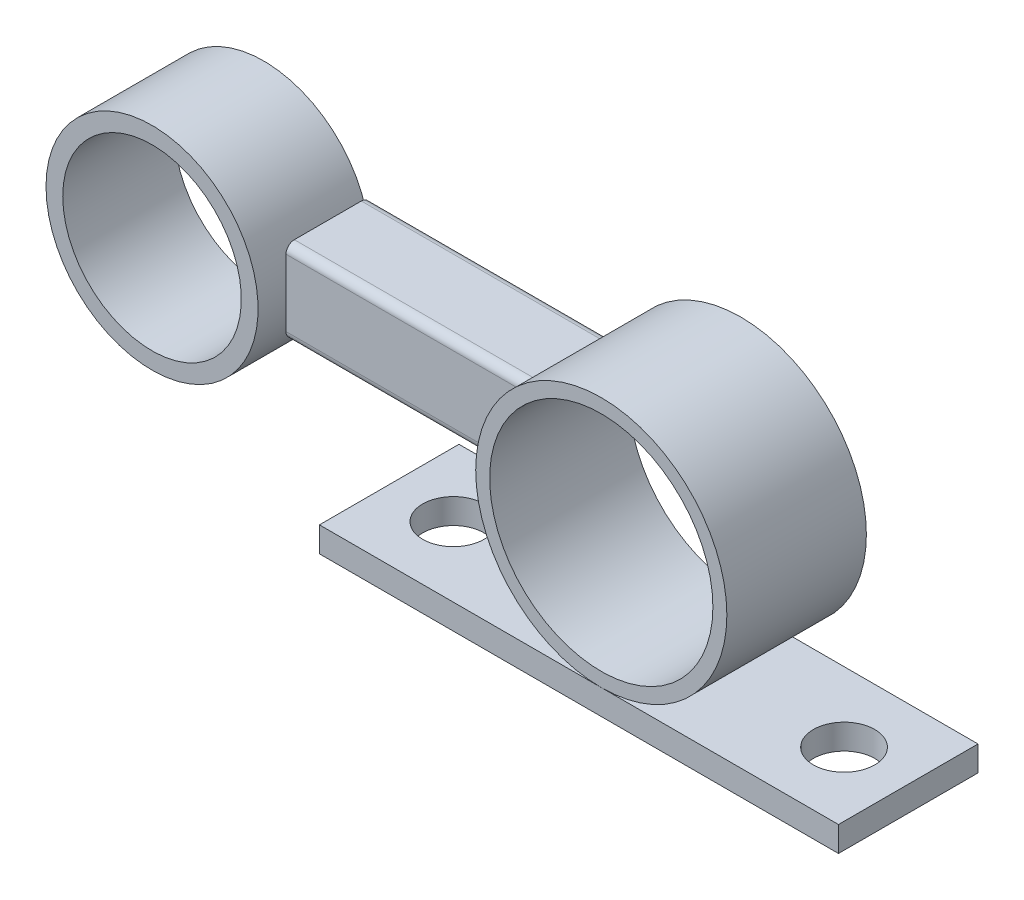
ISO-10303-21;
HEADER;
FILE_DESCRIPTION(('STEP AP214'),'2;1');
FILE_NAME('part.step','',(''),(''),'','','');
FILE_SCHEMA(('AUTOMOTIVE_DESIGN { 1 0 10303 214 1 1 1 1 }'));
ENDSEC;
DATA;
#1=APPLICATION_CONTEXT('core data for automotive mechanical design processes');
#2=APPLICATION_PROTOCOL_DEFINITION('international standard','automotive_design',2000,#1);
#3=PRODUCT_CONTEXT('',#1,'mechanical');
#4=PRODUCT('Part','Part','',(#3));
#5=PRODUCT_RELATED_PRODUCT_CATEGORY('part','',(#4));
#6=PRODUCT_DEFINITION_FORMATION('','',#4);
#7=PRODUCT_DEFINITION_CONTEXT('part definition',#1,'design');
#8=PRODUCT_DEFINITION('design','',#6,#7);
#9=PRODUCT_DEFINITION_SHAPE('','',#8);
#10=(LENGTH_UNIT() NAMED_UNIT(*) SI_UNIT(.MILLI.,.METRE.));
#11=(NAMED_UNIT(*) PLANE_ANGLE_UNIT() SI_UNIT($,.RADIAN.));
#12=(NAMED_UNIT(*) SI_UNIT($,.STERADIAN.) SOLID_ANGLE_UNIT());
#13=UNCERTAINTY_MEASURE_WITH_UNIT(LENGTH_MEASURE(1.E-05),#10,'distance_accuracy_value','');
#14=(GEOMETRIC_REPRESENTATION_CONTEXT(3) GLOBAL_UNCERTAINTY_ASSIGNED_CONTEXT((#13)) GLOBAL_UNIT_ASSIGNED_CONTEXT((#10,
#11,#12)) REPRESENTATION_CONTEXT('',''));
#15=CARTESIAN_POINT('',(0.,0.,0.));
#16=DIRECTION('',(0.,0.,1.));
#17=DIRECTION('',(1.,0.,0.));
#18=AXIS2_PLACEMENT_3D('',#15,#16,#17);
#19=CARTESIAN_POINT('',(-81.494443758404,27.4999999999999,7.49999999999995));
#20=DIRECTION('',(0.,0.,-1.));
#21=DIRECTION('',(-1.,0.,0.));
#22=AXIS2_PLACEMENT_3D('',#19,#20,#21);
#23=CYLINDRICAL_SURFACE('',#22,19.);
#24=CARTESIAN_POINT('',(-81.494443758404,27.4999999999999,7.49999999999995));
#25=DIRECTION('',(0.,0.,-1.));
#26=DIRECTION('',(-1.,0.,0.));
#27=AXIS2_PLACEMENT_3D('',#24,#25,#26);
#28=CIRCLE('',#27,19.);
#29=CARTESIAN_POINT('',(-100.494443758404,27.4999999999999,7.49999999999995));
#30=VERTEX_POINT('',#29);
#31=EDGE_CURVE('E14',#30,#30,#28,.T.);
#32=ORIENTED_EDGE('',*,*,#31,.T.);
#33=EDGE_LOOP('',(#32));
#34=FACE_BOUND('',#33,.T.);
#35=CARTESIAN_POINT('',(-81.494443758404,27.4999999999999,-12.5));
#36=DIRECTION('',(0.,0.,-1.));
#37=DIRECTION('',(-1.,0.,0.));
#38=AXIS2_PLACEMENT_3D('',#35,#36,#37);
#39=CIRCLE('',#38,19.);
#40=CARTESIAN_POINT('',(-100.494443758404,27.4999999999999,-12.5));
#41=VERTEX_POINT('',#40);
#42=EDGE_CURVE('E88',#41,#41,#39,.T.);
#43=ORIENTED_EDGE('',*,*,#42,.F.);
#44=EDGE_LOOP('',(#43));
#45=FACE_BOUND('',#44,.T.);
#46=ADVANCED_FACE('F85',(#34,#45),#23,.T.);
#47=CARTESIAN_POINT('',(-81.494443758404,27.4999999999999,7.49999999999995));
#48=DIRECTION('',(0.,0.,-1.));
#49=DIRECTION('',(-1.,0.,0.));
#50=AXIS2_PLACEMENT_3D('',#47,#48,#49);
#51=PLANE('',#50);
#52=CARTESIAN_POINT('',(-81.494443758404,27.4999999999999,7.49999999999995));
#53=DIRECTION('',(0.,0.,-1.));
#54=DIRECTION('',(-1.,0.,0.));
#55=AXIS2_PLACEMENT_3D('',#52,#53,#54);
#56=CIRCLE('',#55,16.);
#57=CARTESIAN_POINT('',(-97.494443758404,27.4999999999999,7.49999999999995));
#58=VERTEX_POINT('',#57);
#59=EDGE_CURVE('E95',#58,#58,#56,.T.);
#60=ORIENTED_EDGE('',*,*,#59,.T.);
#61=EDGE_LOOP('',(#60));
#62=FACE_BOUND('',#61,.T.);
#63=ORIENTED_EDGE('',*,*,#31,.F.);
#64=EDGE_LOOP('',(#63));
#65=FACE_BOUND('',#64,.T.);
#66=ADVANCED_FACE('F103',(#62,#65),#51,.F.);
#67=CARTESIAN_POINT('',(-81.494443758404,27.4999999999999,-12.5));
#68=DIRECTION('',(0.,0.,-1.));
#69=DIRECTION('',(-1.,0.,0.));
#70=AXIS2_PLACEMENT_3D('',#67,#68,#69);
#71=PLANE('',#70);
#72=CARTESIAN_POINT('',(-81.494443758404,27.4999999999999,-12.5));
#73=DIRECTION('',(0.,0.,-1.));
#74=DIRECTION('',(-1.,0.,0.));
#75=AXIS2_PLACEMENT_3D('',#72,#73,#74);
#76=CIRCLE('',#75,16.);
#77=CARTESIAN_POINT('',(-97.494443758404,27.4999999999999,-12.5));
#78=VERTEX_POINT('',#77);
#79=EDGE_CURVE('E97',#78,#78,#76,.T.);
#80=ORIENTED_EDGE('',*,*,#79,.F.);
#81=EDGE_LOOP('',(#80));
#82=FACE_BOUND('',#81,.T.);
#83=ORIENTED_EDGE('',*,*,#42,.T.);
#84=EDGE_LOOP('',(#83));
#85=FACE_BOUND('',#84,.T.);
#86=ADVANCED_FACE('F109',(#82,#85),#71,.T.);
#87=CARTESIAN_POINT('',(-81.494443758404,27.4999999999999,7.49999999999995));
#88=DIRECTION('',(0.,0.,-1.));
#89=DIRECTION('',(-1.,0.,0.));
#90=AXIS2_PLACEMENT_3D('',#87,#88,#89);
#91=CYLINDRICAL_SURFACE('',#90,16.);
#92=ORIENTED_EDGE('',*,*,#59,.F.);
#93=EDGE_LOOP('',(#92));
#94=FACE_BOUND('',#93,.T.);
#95=ORIENTED_EDGE('',*,*,#79,.T.);
#96=EDGE_LOOP('',(#95));
#97=FACE_BOUND('',#96,.T.);
#98=ADVANCED_FACE('F106',(#94,#97),#91,.F.);
#99=CLOSED_SHELL('',(#46,#66,#86,#98));
#100=MANIFOLD_SOLID_BREP('B2',#99);
#101=CARTESIAN_POINT('',(-18.494443758404,21.5,-11.));
#102=DIRECTION('',(-1.,0.,0.));
#103=DIRECTION('',(0.,0.,1.));
#104=AXIS2_PLACEMENT_3D('',#101,#102,#103);
#105=CYLINDRICAL_SURFACE('',#104,1.5);
#106=CARTESIAN_POINT('',(-62.4944437584039,21.4999999999999,-11.));
#107=DIRECTION('',(1.,0.,0.));
#108=DIRECTION('',(0.,0.,-1.));
#109=AXIS2_PLACEMENT_3D('',#106,#107,#108);
#110=CIRCLE('',#109,1.5);
#111=CARTESIAN_POINT('',(-62.4944437584039,19.9999999999999,-11.));
#112=VERTEX_POINT('',#111);
#113=CARTESIAN_POINT('',(-62.4944437584039,21.4999999999999,-12.5));
#114=VERTEX_POINT('',#113);
#115=EDGE_CURVE('E320',#112,#114,#110,.T.);
#116=ORIENTED_EDGE('',*,*,#115,.T.);
#117=DIRECTION('',(-1.,0.,0.));
#118=VECTOR('',#117,1.);
#119=CARTESIAN_POINT('',(-18.494443758404,21.5,-12.5));
#120=LINE('',#119,#118);
#121=CARTESIAN_POINT('',(-18.494443758404,21.5,-12.5));
#122=VERTEX_POINT('',#121);
#123=EDGE_CURVE('E83',#122,#114,#120,.T.);
#124=ORIENTED_EDGE('',*,*,#123,.F.);
#125=CARTESIAN_POINT('',(-18.494443758404,21.5,-11.));
#126=DIRECTION('',(1.,0.,0.));
#127=DIRECTION('',(0.,0.,-1.));
#128=AXIS2_PLACEMENT_3D('',#125,#126,#127);
#129=CIRCLE('',#128,1.5);
#130=CARTESIAN_POINT('',(-18.494443758404,20.,-11.));
#131=VERTEX_POINT('',#130);
#132=EDGE_CURVE('E398',#131,#122,#129,.T.);
#133=ORIENTED_EDGE('',*,*,#132,.F.);
#134=DIRECTION('',(-1.,0.,0.));
#135=VECTOR('',#134,1.);
#136=CARTESIAN_POINT('',(-18.494443758404,20.,-11.));
#137=LINE('',#136,#135);
#138=EDGE_CURVE('E335',#131,#112,#137,.T.);
#139=ORIENTED_EDGE('',*,*,#138,.T.);
#140=EDGE_LOOP('',(#116,#124,#133,#139));
#141=FACE_BOUND('',#140,.T.);
#142=ADVANCED_FACE('F148',(#141),#105,.T.);
#143=CARTESIAN_POINT('',(-18.494443758404,21.5,-12.5));
#144=DIRECTION('',(0.,0.,1.));
#145=DIRECTION('',(1.,0.,0.));
#146=AXIS2_PLACEMENT_3D('',#143,#144,#145);
#147=PLANE('',#146);
#148=DIRECTION('',(0.,1.,0.));
#149=VECTOR('',#148,1.);
#150=CARTESIAN_POINT('',(-62.4944437584039,21.4999999999999,-12.5));
#151=LINE('',#150,#149);
#152=CARTESIAN_POINT('',(-62.4944437584039,33.4999999999999,-12.5));
#153=VERTEX_POINT('',#152);
#154=EDGE_CURVE('E323',#114,#153,#151,.T.);
#155=ORIENTED_EDGE('',*,*,#154,.T.);
#156=DIRECTION('',(-1.,0.,0.));
#157=VECTOR('',#156,1.);
#158=CARTESIAN_POINT('',(-18.494443758404,33.5,-12.5));
#159=LINE('',#158,#157);
#160=CARTESIAN_POINT('',(-18.494443758404,33.5,-12.5));
#161=VERTEX_POINT('',#160);
#162=EDGE_CURVE('E158',#161,#153,#159,.T.);
#163=ORIENTED_EDGE('',*,*,#162,.F.);
#164=DIRECTION('',(0.,1.,0.));
#165=VECTOR('',#164,1.);
#166=CARTESIAN_POINT('',(-18.494443758404,21.5,-12.5));
#167=LINE('',#166,#165);
#168=EDGE_CURVE('E400',#122,#161,#167,.T.);
#169=ORIENTED_EDGE('',*,*,#168,.F.);
#170=ORIENTED_EDGE('',*,*,#123,.T.);
#171=EDGE_LOOP('',(#155,#163,#169,#170));
#172=FACE_BOUND('',#171,.T.);
#173=ADVANCED_FACE('F435',(#172),#147,.F.);
#174=CARTESIAN_POINT('',(-18.494443758404,33.5,-11.));
#175=DIRECTION('',(-1.,0.,0.));
#176=DIRECTION('',(0.,0.,1.));
#177=AXIS2_PLACEMENT_3D('',#174,#175,#176);
#178=CYLINDRICAL_SURFACE('',#177,1.5);
#179=CARTESIAN_POINT('',(-62.4944437584039,33.4999999999999,-11.));
#180=DIRECTION('',(1.,0.,0.));
#181=DIRECTION('',(0.,0.,-1.));
#182=AXIS2_PLACEMENT_3D('',#179,#180,#181);
#183=CIRCLE('',#182,1.5);
#184=CARTESIAN_POINT('',(-62.4944437584039,34.9999999999999,-11.));
#185=VERTEX_POINT('',#184);
#186=EDGE_CURVE('E325',#153,#185,#183,.T.);
#187=ORIENTED_EDGE('',*,*,#186,.T.);
#188=DIRECTION('',(-1.,0.,0.));
#189=VECTOR('',#188,1.);
#190=CARTESIAN_POINT('',(-18.494443758404,35.,-11.));
#191=LINE('',#190,#189);
#192=CARTESIAN_POINT('',(-18.494443758404,35.,-11.));
#193=VERTEX_POINT('',#192);
#194=EDGE_CURVE('E342',#193,#185,#191,.T.);
#195=ORIENTED_EDGE('',*,*,#194,.F.);
#196=CARTESIAN_POINT('',(-18.494443758404,33.5,-11.));
#197=DIRECTION('',(1.,0.,0.));
#198=DIRECTION('',(0.,0.,-1.));
#199=AXIS2_PLACEMENT_3D('',#196,#197,#198);
#200=CIRCLE('',#199,1.5);
#201=EDGE_CURVE('E402',#161,#193,#200,.T.);
#202=ORIENTED_EDGE('',*,*,#201,.F.);
#203=ORIENTED_EDGE('',*,*,#162,.T.);
#204=EDGE_LOOP('',(#187,#195,#202,#203));
#205=FACE_BOUND('',#204,.T.);
#206=ADVANCED_FACE('F440',(#205),#178,.T.);
#207=CARTESIAN_POINT('',(-18.494443758404,35.,1.));
#208=DIRECTION('',(0.,-1.,0.));
#209=DIRECTION('',(0.,0.,-1.));
#210=AXIS2_PLACEMENT_3D('',#207,#208,#209);
#211=PLANE('',#210);
#212=DIRECTION('',(0.,0.,1.));
#213=VECTOR('',#212,1.);
#214=CARTESIAN_POINT('',(-62.4944437584039,34.9999999999999,1.));
#215=LINE('',#214,#213);
#216=CARTESIAN_POINT('',(-62.4944437584039,34.9999999999999,1.));
#217=VERTEX_POINT('',#216);
#218=EDGE_CURVE('E327',#185,#217,#215,.T.);
#219=ORIENTED_EDGE('',*,*,#218,.T.);
#220=DIRECTION('',(-1.,0.,0.));
#221=VECTOR('',#220,1.);
#222=CARTESIAN_POINT('',(-18.494443758404,35.,1.));
#223=LINE('',#222,#221);
#224=CARTESIAN_POINT('',(-18.494443758404,35.,1.));
#225=VERTEX_POINT('',#224);
#226=EDGE_CURVE('E339',#225,#217,#223,.T.);
#227=ORIENTED_EDGE('',*,*,#226,.F.);
#228=DIRECTION('',(0.,0.,1.));
#229=VECTOR('',#228,1.);
#230=CARTESIAN_POINT('',(-18.494443758404,35.,1.));
#231=LINE('',#230,#229);
#232=EDGE_CURVE('E404',#193,#225,#231,.T.);
#233=ORIENTED_EDGE('',*,*,#232,.F.);
#234=ORIENTED_EDGE('',*,*,#194,.T.);
#235=EDGE_LOOP('',(#219,#227,#233,#234));
#236=FACE_BOUND('',#235,.T.);
#237=ADVANCED_FACE('F410',(#236),#211,.F.);
#238=CARTESIAN_POINT('',(-18.494443758404,33.5,1.));
#239=DIRECTION('',(-1.,0.,0.));
#240=DIRECTION('',(0.,0.,1.));
#241=AXIS2_PLACEMENT_3D('',#238,#239,#240);
#242=CYLINDRICAL_SURFACE('',#241,1.5);
#243=CARTESIAN_POINT('',(-62.4944437584039,33.4999999999999,1.));
#244=DIRECTION('',(1.,0.,0.));
#245=DIRECTION('',(0.,0.,-1.));
#246=AXIS2_PLACEMENT_3D('',#243,#244,#245);
#247=CIRCLE('',#246,1.5);
#248=CARTESIAN_POINT('',(-62.4944437584039,33.4999999999999,2.49999999999995));
#249=VERTEX_POINT('',#248);
#250=EDGE_CURVE('E329',#217,#249,#247,.T.);
#251=ORIENTED_EDGE('',*,*,#250,.T.);
#252=DIRECTION('',(-1.,0.,0.));
#253=VECTOR('',#252,1.);
#254=CARTESIAN_POINT('',(-18.494443758404,33.5,2.49999999999995));
#255=LINE('',#254,#253);
#256=CARTESIAN_POINT('',(-18.494443758404,33.5,2.49999999999995));
#257=VERTEX_POINT('',#256);
#258=EDGE_CURVE('E287',#257,#249,#255,.T.);
#259=ORIENTED_EDGE('',*,*,#258,.F.);
#260=CARTESIAN_POINT('',(-18.494443758404,33.5,1.));
#261=DIRECTION('',(1.,0.,0.));
#262=DIRECTION('',(0.,0.,-1.));
#263=AXIS2_PLACEMENT_3D('',#260,#261,#262);
#264=CIRCLE('',#263,1.5);
#265=EDGE_CURVE('E278',#225,#257,#264,.T.);
#266=ORIENTED_EDGE('',*,*,#265,.F.);
#267=ORIENTED_EDGE('',*,*,#226,.T.);
#268=EDGE_LOOP('',(#251,#259,#266,#267));
#269=FACE_BOUND('',#268,.T.);
#270=ADVANCED_FACE('F414',(#269),#242,.T.);
#271=CARTESIAN_POINT('',(-18.494443758404,33.5,2.49999999999995));
#272=DIRECTION('',(0.,0.,-1.));
#273=DIRECTION('',(-1.,0.,0.));
#274=AXIS2_PLACEMENT_3D('',#271,#272,#273);
#275=PLANE('',#274);
#276=DIRECTION('',(0.,-1.,0.));
#277=VECTOR('',#276,1.);
#278=CARTESIAN_POINT('',(-62.4944437584039,33.4999999999999,2.49999999999995));
#279=LINE('',#278,#277);
#280=CARTESIAN_POINT('',(-62.4944437584039,21.4999999999999,2.49999999999995));
#281=VERTEX_POINT('',#280);
#282=EDGE_CURVE('E286',#249,#281,#279,.T.);
#283=ORIENTED_EDGE('',*,*,#282,.T.);
#284=DIRECTION('',(-1.,0.,0.));
#285=VECTOR('',#284,1.);
#286=CARTESIAN_POINT('',(-18.494443758404,21.5,2.49999999999995));
#287=LINE('',#286,#285);
#288=CARTESIAN_POINT('',(-18.494443758404,21.5,2.49999999999995));
#289=VERTEX_POINT('',#288);
#290=EDGE_CURVE('E283',#289,#281,#287,.T.);
#291=ORIENTED_EDGE('',*,*,#290,.F.);
#292=DIRECTION('',(0.,-1.,0.));
#293=VECTOR('',#292,1.);
#294=CARTESIAN_POINT('',(-18.494443758404,33.5,2.49999999999995));
#295=LINE('',#294,#293);
#296=EDGE_CURVE('E272',#257,#289,#295,.T.);
#297=ORIENTED_EDGE('',*,*,#296,.F.);
#298=ORIENTED_EDGE('',*,*,#258,.T.);
#299=EDGE_LOOP('',(#283,#291,#297,#298));
#300=FACE_BOUND('',#299,.T.);
#301=ADVANCED_FACE('F284',(#300),#275,.F.);
#302=CARTESIAN_POINT('',(-18.494443758404,21.5,1.));
#303=DIRECTION('',(-1.,0.,0.));
#304=DIRECTION('',(0.,0.,1.));
#305=AXIS2_PLACEMENT_3D('',#302,#303,#304);
#306=CYLINDRICAL_SURFACE('',#305,1.5);
#307=CARTESIAN_POINT('',(-62.4944437584039,21.4999999999999,1.));
#308=DIRECTION('',(1.,0.,0.));
#309=DIRECTION('',(0.,0.,-1.));
#310=AXIS2_PLACEMENT_3D('',#307,#308,#309);
#311=CIRCLE('',#310,1.5);
#312=CARTESIAN_POINT('',(-62.4944437584039,19.9999999999999,1.));
#313=VERTEX_POINT('',#312);
#314=EDGE_CURVE('E220',#281,#313,#311,.T.);
#315=ORIENTED_EDGE('',*,*,#314,.T.);
#316=DIRECTION('',(-1.,0.,0.));
#317=VECTOR('',#316,1.);
#318=CARTESIAN_POINT('',(-18.494443758404,20.,1.));
#319=LINE('',#318,#317);
#320=CARTESIAN_POINT('',(-18.494443758404,20.,1.));
#321=VERTEX_POINT('',#320);
#322=EDGE_CURVE('E288',#321,#313,#319,.T.);
#323=ORIENTED_EDGE('',*,*,#322,.F.);
#324=CARTESIAN_POINT('',(-18.494443758404,21.5,1.));
#325=DIRECTION('',(1.,0.,0.));
#326=DIRECTION('',(0.,0.,-1.));
#327=AXIS2_PLACEMENT_3D('',#324,#325,#326);
#328=CIRCLE('',#327,1.5);
#329=EDGE_CURVE('E276',#289,#321,#328,.T.);
#330=ORIENTED_EDGE('',*,*,#329,.F.);
#331=ORIENTED_EDGE('',*,*,#290,.T.);
#332=EDGE_LOOP('',(#315,#323,#330,#331));
#333=FACE_BOUND('',#332,.T.);
#334=ADVANCED_FACE('F290',(#333),#306,.T.);
#335=CARTESIAN_POINT('',(-18.494443758404,33.5,-11.));
#336=DIRECTION('',(-1.,0.,0.));
#337=DIRECTION('',(0.,0.,1.));
#338=AXIS2_PLACEMENT_3D('',#335,#336,#337);
#339=CYLINDRICAL_SURFACE('',#338,0.499999999999996);
#340=CARTESIAN_POINT('',(-62.4944437584039,33.4999999999999,-11.));
#341=DIRECTION('',(1.,0.,0.));
#342=DIRECTION('',(0.,0.,-1.));
#343=AXIS2_PLACEMENT_3D('',#340,#341,#342);
#344=CIRCLE('',#343,0.499999999999996);
#345=CARTESIAN_POINT('',(-62.4944437584039,33.4999999999999,-11.5));
#346=VERTEX_POINT('',#345);
#347=CARTESIAN_POINT('',(-62.4944437584039,33.9999999999999,-11.));
#348=VERTEX_POINT('',#347);
#349=EDGE_CURVE('E296',#346,#348,#344,.T.);
#350=ORIENTED_EDGE('',*,*,#349,.F.);
#351=DIRECTION('',(-1.,0.,0.));
#352=VECTOR('',#351,1.);
#353=CARTESIAN_POINT('',(-18.494443758404,33.5,-11.5));
#354=LINE('',#353,#352);
#355=CARTESIAN_POINT('',(-18.494443758404,33.5,-11.5));
#356=VERTEX_POINT('',#355);
#357=EDGE_CURVE('E152',#356,#346,#354,.T.);
#358=ORIENTED_EDGE('',*,*,#357,.F.);
#359=CARTESIAN_POINT('',(-18.494443758404,33.5,-11.));
#360=DIRECTION('',(1.,0.,0.));
#361=DIRECTION('',(0.,0.,-1.));
#362=AXIS2_PLACEMENT_3D('',#359,#360,#361);
#363=CIRCLE('',#362,0.499999999999996);
#364=CARTESIAN_POINT('',(-18.494443758404,34.,-11.));
#365=VERTEX_POINT('',#364);
#366=EDGE_CURVE('E334',#356,#365,#363,.T.);
#367=ORIENTED_EDGE('',*,*,#366,.T.);
#368=DIRECTION('',(-1.,0.,0.));
#369=VECTOR('',#368,1.);
#370=CARTESIAN_POINT('',(-18.494443758404,34.,-11.));
#371=LINE('',#370,#369);
#372=EDGE_CURVE('E292',#365,#348,#371,.T.);
#373=ORIENTED_EDGE('',*,*,#372,.T.);
#374=EDGE_LOOP('',(#350,#358,#367,#373));
#375=FACE_BOUND('',#374,.T.);
#376=ADVANCED_FACE('F150',(#375),#339,.F.);
#377=CARTESIAN_POINT('',(-18.494443758404,21.5,-11.5));
#378=DIRECTION('',(0.,0.,1.));
#379=DIRECTION('',(1.,0.,0.));
#380=AXIS2_PLACEMENT_3D('',#377,#378,#379);
#381=PLANE('',#380);
#382=DIRECTION('',(0.,1.,0.));
#383=VECTOR('',#382,1.);
#384=CARTESIAN_POINT('',(-62.4944437584039,21.4999999999999,-11.5));
#385=LINE('',#384,#383);
#386=CARTESIAN_POINT('',(-62.4944437584039,21.4999999999999,-11.5));
#387=VERTEX_POINT('',#386);
#388=EDGE_CURVE('E299',#387,#346,#385,.T.);
#389=ORIENTED_EDGE('',*,*,#388,.F.);
#390=DIRECTION('',(-1.,0.,0.));
#391=VECTOR('',#390,1.);
#392=CARTESIAN_POINT('',(-18.494443758404,21.5,-11.5));
#393=LINE('',#392,#391);
#394=CARTESIAN_POINT('',(-18.494443758404,21.5,-11.5));
#395=VERTEX_POINT('',#394);
#396=EDGE_CURVE('E357',#395,#387,#393,.T.);
#397=ORIENTED_EDGE('',*,*,#396,.F.);
#398=DIRECTION('',(0.,1.,0.));
#399=VECTOR('',#398,1.);
#400=CARTESIAN_POINT('',(-18.494443758404,21.5,-11.5));
#401=LINE('',#400,#399);
#402=EDGE_CURVE('E366',#395,#356,#401,.T.);
#403=ORIENTED_EDGE('',*,*,#402,.T.);
#404=ORIENTED_EDGE('',*,*,#357,.T.);
#405=EDGE_LOOP('',(#389,#397,#403,#404));
#406=FACE_BOUND('',#405,.T.);
#407=ADVANCED_FACE('F364',(#406),#381,.T.);
#408=CARTESIAN_POINT('',(-18.494443758404,21.5,-11.));
#409=DIRECTION('',(-1.,0.,0.));
#410=DIRECTION('',(0.,0.,1.));
#411=AXIS2_PLACEMENT_3D('',#408,#409,#410);
#412=CYLINDRICAL_SURFACE('',#411,0.499999999999998);
#413=CARTESIAN_POINT('',(-62.4944437584039,21.4999999999999,-11.));
#414=DIRECTION('',(1.,0.,0.));
#415=DIRECTION('',(0.,0.,-1.));
#416=AXIS2_PLACEMENT_3D('',#413,#414,#415);
#417=CIRCLE('',#416,0.499999999999998);
#418=CARTESIAN_POINT('',(-62.4944437584039,20.9999999999999,-11.));
#419=VERTEX_POINT('',#418);
#420=EDGE_CURVE('E302',#419,#387,#417,.T.);
#421=ORIENTED_EDGE('',*,*,#420,.F.);
#422=DIRECTION('',(-1.,0.,0.));
#423=VECTOR('',#422,1.);
#424=CARTESIAN_POINT('',(-18.494443758404,21.,-11.));
#425=LINE('',#424,#423);
#426=CARTESIAN_POINT('',(-18.494443758404,21.,-11.));
#427=VERTEX_POINT('',#426);
#428=EDGE_CURVE('E356',#427,#419,#425,.T.);
#429=ORIENTED_EDGE('',*,*,#428,.F.);
#430=CARTESIAN_POINT('',(-18.494443758404,21.5,-11.));
#431=DIRECTION('',(1.,0.,0.));
#432=DIRECTION('',(0.,0.,-1.));
#433=AXIS2_PLACEMENT_3D('',#430,#431,#432);
#434=CIRCLE('',#433,0.499999999999998);
#435=EDGE_CURVE('E374',#427,#395,#434,.T.);
#436=ORIENTED_EDGE('',*,*,#435,.T.);
#437=ORIENTED_EDGE('',*,*,#396,.T.);
#438=EDGE_LOOP('',(#421,#429,#436,#437));
#439=FACE_BOUND('',#438,.T.);
#440=ADVANCED_FACE('F372',(#439),#412,.F.);
#441=CARTESIAN_POINT('',(-18.494443758404,21.,-11.));
#442=DIRECTION('',(0.,1.,0.));
#443=DIRECTION('',(0.,0.,1.));
#444=AXIS2_PLACEMENT_3D('',#441,#442,#443);
#445=PLANE('',#444);
#446=DIRECTION('',(0.,0.,-1.));
#447=VECTOR('',#446,1.);
#448=CARTESIAN_POINT('',(-62.4944437584039,20.9999999999999,-11.));
#449=LINE('',#448,#447);
#450=CARTESIAN_POINT('',(-62.4944437584039,20.9999999999999,1.));
#451=VERTEX_POINT('',#450);
#452=EDGE_CURVE('E305',#451,#419,#449,.T.);
#453=ORIENTED_EDGE('',*,*,#452,.F.);
#454=DIRECTION('',(-1.,0.,0.));
#455=VECTOR('',#454,1.);
#456=CARTESIAN_POINT('',(-18.494443758404,21.,1.));
#457=LINE('',#456,#455);
#458=CARTESIAN_POINT('',(-18.494443758404,21.,1.));
#459=VERTEX_POINT('',#458);
#460=EDGE_CURVE('E354',#459,#451,#457,.T.);
#461=ORIENTED_EDGE('',*,*,#460,.F.);
#462=DIRECTION('',(0.,0.,-1.));
#463=VECTOR('',#462,1.);
#464=CARTESIAN_POINT('',(-18.494443758404,21.,-11.));
#465=LINE('',#464,#463);
#466=EDGE_CURVE('E380',#459,#427,#465,.T.);
#467=ORIENTED_EDGE('',*,*,#466,.T.);
#468=ORIENTED_EDGE('',*,*,#428,.T.);
#469=EDGE_LOOP('',(#453,#461,#467,#468));
#470=FACE_BOUND('',#469,.T.);
#471=ADVANCED_FACE('F383',(#470),#445,.T.);
#472=CARTESIAN_POINT('',(-18.494443758404,21.5,1.));
#473=DIRECTION('',(-1.,0.,0.));
#474=DIRECTION('',(0.,0.,1.));
#475=AXIS2_PLACEMENT_3D('',#472,#473,#474);
#476=CYLINDRICAL_SURFACE('',#475,0.499999999999997);
#477=CARTESIAN_POINT('',(-62.4944437584039,21.4999999999999,1.));
#478=DIRECTION('',(1.,0.,0.));
#479=DIRECTION('',(0.,0.,-1.));
#480=AXIS2_PLACEMENT_3D('',#477,#478,#479);
#481=CIRCLE('',#480,0.499999999999997);
#482=CARTESIAN_POINT('',(-62.4944437584039,21.4999999999999,1.49999999999995));
#483=VERTEX_POINT('',#482);
#484=EDGE_CURVE('E308',#483,#451,#481,.T.);
#485=ORIENTED_EDGE('',*,*,#484,.F.);
#486=DIRECTION('',(-1.,0.,0.));
#487=VECTOR('',#486,1.);
#488=CARTESIAN_POINT('',(-18.494443758404,21.5,1.49999999999995));
#489=LINE('',#488,#487);
#490=CARTESIAN_POINT('',(-18.494443758404,21.5,1.49999999999995));
#491=VERTEX_POINT('',#490);
#492=EDGE_CURVE('E352',#491,#483,#489,.T.);
#493=ORIENTED_EDGE('',*,*,#492,.F.);
#494=CARTESIAN_POINT('',(-18.494443758404,21.5,1.));
#495=DIRECTION('',(1.,0.,0.));
#496=DIRECTION('',(0.,0.,-1.));
#497=AXIS2_PLACEMENT_3D('',#494,#495,#496);
#498=CIRCLE('',#497,0.499999999999997);
#499=EDGE_CURVE('E384',#491,#459,#498,.T.);
#500=ORIENTED_EDGE('',*,*,#499,.T.);
#501=ORIENTED_EDGE('',*,*,#460,.T.);
#502=EDGE_LOOP('',(#485,#493,#500,#501));
#503=FACE_BOUND('',#502,.T.);
#504=ADVANCED_FACE('F451',(#503),#476,.F.);
#505=CARTESIAN_POINT('',(-18.494443758404,33.5,1.49999999999995));
#506=DIRECTION('',(0.,0.,-1.));
#507=DIRECTION('',(-1.,0.,0.));
#508=AXIS2_PLACEMENT_3D('',#505,#506,#507);
#509=PLANE('',#508);
#510=DIRECTION('',(0.,-1.,0.));
#511=VECTOR('',#510,1.);
#512=CARTESIAN_POINT('',(-62.4944437584039,33.4999999999999,1.49999999999995));
#513=LINE('',#512,#511);
#514=CARTESIAN_POINT('',(-62.4944437584039,33.4999999999999,1.49999999999995));
#515=VERTEX_POINT('',#514);
#516=EDGE_CURVE('E311',#515,#483,#513,.T.);
#517=ORIENTED_EDGE('',*,*,#516,.F.);
#518=DIRECTION('',(-1.,0.,0.));
#519=VECTOR('',#518,1.);
#520=CARTESIAN_POINT('',(-18.494443758404,33.5,1.49999999999995));
#521=LINE('',#520,#519);
#522=CARTESIAN_POINT('',(-18.494443758404,33.5,1.49999999999995));
#523=VERTEX_POINT('',#522);
#524=EDGE_CURVE('E350',#523,#515,#521,.T.);
#525=ORIENTED_EDGE('',*,*,#524,.F.);
#526=DIRECTION('',(0.,-1.,0.));
#527=VECTOR('',#526,1.);
#528=CARTESIAN_POINT('',(-18.494443758404,33.5,1.49999999999995));
#529=LINE('',#528,#527);
#530=EDGE_CURVE('E386',#523,#491,#529,.T.);
#531=ORIENTED_EDGE('',*,*,#530,.T.);
#532=ORIENTED_EDGE('',*,*,#492,.T.);
#533=EDGE_LOOP('',(#517,#525,#531,#532));
#534=FACE_BOUND('',#533,.T.);
#535=ADVANCED_FACE('F447',(#534),#509,.T.);
#536=CARTESIAN_POINT('',(-18.494443758404,33.5,1.));
#537=DIRECTION('',(-1.,0.,0.));
#538=DIRECTION('',(0.,0.,1.));
#539=AXIS2_PLACEMENT_3D('',#536,#537,#538);
#540=CYLINDRICAL_SURFACE('',#539,0.499999999999996);
#541=CARTESIAN_POINT('',(-62.4944437584039,33.4999999999999,1.));
#542=DIRECTION('',(1.,0.,0.));
#543=DIRECTION('',(0.,0.,-1.));
#544=AXIS2_PLACEMENT_3D('',#541,#542,#543);
#545=CIRCLE('',#544,0.499999999999996);
#546=CARTESIAN_POINT('',(-62.4944437584039,33.9999999999999,1.));
#547=VERTEX_POINT('',#546);
#548=EDGE_CURVE('E314',#547,#515,#545,.T.);
#549=ORIENTED_EDGE('',*,*,#548,.F.);
#550=DIRECTION('',(-1.,0.,0.));
#551=VECTOR('',#550,1.);
#552=CARTESIAN_POINT('',(-18.494443758404,34.,1.));
#553=LINE('',#552,#551);
#554=CARTESIAN_POINT('',(-18.494443758404,34.,1.));
#555=VERTEX_POINT('',#554);
#556=EDGE_CURVE('E348',#555,#547,#553,.T.);
#557=ORIENTED_EDGE('',*,*,#556,.F.);
#558=CARTESIAN_POINT('',(-18.494443758404,33.5,1.));
#559=DIRECTION('',(1.,0.,0.));
#560=DIRECTION('',(0.,0.,-1.));
#561=AXIS2_PLACEMENT_3D('',#558,#559,#560);
#562=CIRCLE('',#561,0.499999999999996);
#563=EDGE_CURVE('E392',#555,#523,#562,.T.);
#564=ORIENTED_EDGE('',*,*,#563,.T.);
#565=ORIENTED_EDGE('',*,*,#524,.T.);
#566=EDGE_LOOP('',(#549,#557,#564,#565));
#567=FACE_BOUND('',#566,.T.);
#568=ADVANCED_FACE('F429',(#567),#540,.F.);
#569=CARTESIAN_POINT('',(-18.494443758404,34.,1.));
#570=DIRECTION('',(0.,-1.,0.));
#571=DIRECTION('',(0.,0.,-1.));
#572=AXIS2_PLACEMENT_3D('',#569,#570,#571);
#573=PLANE('',#572);
#574=DIRECTION('',(0.,0.,1.));
#575=VECTOR('',#574,1.);
#576=CARTESIAN_POINT('',(-62.4944437584039,33.9999999999999,1.));
#577=LINE('',#576,#575);
#578=EDGE_CURVE('E317',#348,#547,#577,.T.);
#579=ORIENTED_EDGE('',*,*,#578,.F.);
#580=ORIENTED_EDGE('',*,*,#372,.F.);
#581=DIRECTION('',(0.,0.,1.));
#582=VECTOR('',#581,1.);
#583=CARTESIAN_POINT('',(-18.494443758404,34.,1.));
#584=LINE('',#583,#582);
#585=EDGE_CURVE('E395',#365,#555,#584,.T.);
#586=ORIENTED_EDGE('',*,*,#585,.T.);
#587=ORIENTED_EDGE('',*,*,#556,.T.);
#588=EDGE_LOOP('',(#579,#580,#586,#587));
#589=FACE_BOUND('',#588,.T.);
#590=ADVANCED_FACE('F422',(#589),#573,.T.);
#591=CARTESIAN_POINT('',(-18.494443758404,20.,-11.));
#592=DIRECTION('',(0.,1.,0.));
#593=DIRECTION('',(0.,0.,1.));
#594=AXIS2_PLACEMENT_3D('',#591,#592,#593);
#595=PLANE('',#594);
#596=DIRECTION('',(0.,0.,-1.));
#597=VECTOR('',#596,1.);
#598=CARTESIAN_POINT('',(-62.4944437584039,19.9999999999999,-11.));
#599=LINE('',#598,#597);
#600=EDGE_CURVE('E226',#313,#112,#599,.T.);
#601=ORIENTED_EDGE('',*,*,#600,.T.);
#602=ORIENTED_EDGE('',*,*,#138,.F.);
#603=DIRECTION('',(0.,0.,-1.));
#604=VECTOR('',#603,1.);
#605=CARTESIAN_POINT('',(-18.494443758404,20.,-11.));
#606=LINE('',#605,#604);
#607=EDGE_CURVE('E167',#321,#131,#606,.T.);
#608=ORIENTED_EDGE('',*,*,#607,.F.);
#609=ORIENTED_EDGE('',*,*,#322,.T.);
#610=EDGE_LOOP('',(#601,#602,#608,#609));
#611=FACE_BOUND('',#610,.T.);
#612=ADVANCED_FACE('F420',(#611),#595,.F.);
#613=CARTESIAN_POINT('',(-18.494443758404,21.5,-11.));
#614=DIRECTION('',(1.,0.,0.));
#615=DIRECTION('',(0.,0.,-1.));
#616=AXIS2_PLACEMENT_3D('',#613,#614,#615);
#617=PLANE('',#616);
#618=ORIENTED_EDGE('',*,*,#366,.F.);
#619=ORIENTED_EDGE('',*,*,#402,.F.);
#620=ORIENTED_EDGE('',*,*,#435,.F.);
#621=ORIENTED_EDGE('',*,*,#466,.F.);
#622=ORIENTED_EDGE('',*,*,#499,.F.);
#623=ORIENTED_EDGE('',*,*,#530,.F.);
#624=ORIENTED_EDGE('',*,*,#563,.F.);
#625=ORIENTED_EDGE('',*,*,#585,.F.);
#626=EDGE_LOOP('',(#618,#619,#620,#621,#622,#623,#624,#625));
#627=FACE_BOUND('',#626,.T.);
#628=ORIENTED_EDGE('',*,*,#132,.T.);
#629=ORIENTED_EDGE('',*,*,#168,.T.);
#630=ORIENTED_EDGE('',*,*,#201,.T.);
#631=ORIENTED_EDGE('',*,*,#232,.T.);
#632=ORIENTED_EDGE('',*,*,#265,.T.);
#633=ORIENTED_EDGE('',*,*,#296,.T.);
#634=ORIENTED_EDGE('',*,*,#329,.T.);
#635=ORIENTED_EDGE('',*,*,#607,.T.);
#636=EDGE_LOOP('',(#628,#629,#630,#631,#632,#633,#634,#635));
#637=FACE_BOUND('',#636,.T.);
#638=ADVANCED_FACE('F274',(#627,#637),#617,.T.);
#639=CARTESIAN_POINT('',(-62.4944437584039,21.4999999999999,-11.));
#640=DIRECTION('',(1.,0.,0.));
#641=DIRECTION('',(0.,0.,-1.));
#642=AXIS2_PLACEMENT_3D('',#639,#640,#641);
#643=PLANE('',#642);
#644=ORIENTED_EDGE('',*,*,#349,.T.);
#645=ORIENTED_EDGE('',*,*,#578,.T.);
#646=ORIENTED_EDGE('',*,*,#548,.T.);
#647=ORIENTED_EDGE('',*,*,#516,.T.);
#648=ORIENTED_EDGE('',*,*,#484,.T.);
#649=ORIENTED_EDGE('',*,*,#452,.T.);
#650=ORIENTED_EDGE('',*,*,#420,.T.);
#651=ORIENTED_EDGE('',*,*,#388,.T.);
#652=EDGE_LOOP('',(#644,#645,#646,#647,#648,#649,#650,#651));
#653=FACE_BOUND('',#652,.T.);
#654=ORIENTED_EDGE('',*,*,#115,.F.);
#655=ORIENTED_EDGE('',*,*,#600,.F.);
#656=ORIENTED_EDGE('',*,*,#314,.F.);
#657=ORIENTED_EDGE('',*,*,#282,.F.);
#658=ORIENTED_EDGE('',*,*,#250,.F.);
#659=ORIENTED_EDGE('',*,*,#218,.F.);
#660=ORIENTED_EDGE('',*,*,#186,.F.);
#661=ORIENTED_EDGE('',*,*,#154,.F.);
#662=EDGE_LOOP('',(#654,#655,#656,#657,#658,#659,#660,#661));
#663=FACE_BOUND('',#662,.T.);
#664=ADVANCED_FACE('F369',(#653,#663),#643,.F.);
#665=CLOSED_SHELL('',(#142,#173,#206,#237,#270,#301,#334,#376,#407,#440,#471,#504,#535,#568,
#590,#612,#638,#664));
#666=MANIFOLD_SOLID_BREP('B9',#665);
#667=CARTESIAN_POINT('',(4.00000000000002,27.,-12.5));
#668=DIRECTION('',(0.,0.,1.));
#669=DIRECTION('',(1.,0.,0.));
#670=AXIS2_PLACEMENT_3D('',#667,#668,#669);
#671=CYLINDRICAL_SURFACE('',#670,22.5);
#672=CARTESIAN_POINT('',(4.00000000000002,27.,-12.5));
#673=DIRECTION('',(0.,0.,1.));
#674=DIRECTION('',(1.,0.,0.));
#675=AXIS2_PLACEMENT_3D('',#672,#673,#674);
#676=CIRCLE('',#675,22.5);
#677=CARTESIAN_POINT('',(26.5,27.,-12.5));
#678=VERTEX_POINT('',#677);
#679=EDGE_CURVE('E147',#678,#678,#676,.T.);
#680=ORIENTED_EDGE('',*,*,#679,.T.);
#681=EDGE_LOOP('',(#680));
#682=FACE_BOUND('',#681,.T.);
#683=CARTESIAN_POINT('',(4.00000000000002,27.,12.5));
#684=DIRECTION('',(0.,0.,1.));
#685=DIRECTION('',(1.,0.,0.));
#686=AXIS2_PLACEMENT_3D('',#683,#684,#685);
#687=CIRCLE('',#686,22.5);
#688=CARTESIAN_POINT('',(26.5,27.,12.5));
#689=VERTEX_POINT('',#688);
#690=EDGE_CURVE('E605',#689,#689,#687,.T.);
#691=ORIENTED_EDGE('',*,*,#690,.F.);
#692=EDGE_LOOP('',(#691));
#693=FACE_BOUND('',#692,.T.);
#694=ADVANCED_FACE('F602',(#682,#693),#671,.T.);
#695=CARTESIAN_POINT('',(4.00000000000002,27.,-12.5));
#696=DIRECTION('',(0.,0.,1.));
#697=DIRECTION('',(1.,0.,0.));
#698=AXIS2_PLACEMENT_3D('',#695,#696,#697);
#699=PLANE('',#698);
#700=CARTESIAN_POINT('',(4.00000000000002,27.,-12.5));
#701=DIRECTION('',(0.,0.,1.));
#702=DIRECTION('',(1.,0.,0.));
#703=AXIS2_PLACEMENT_3D('',#700,#701,#702);
#704=CIRCLE('',#703,20.);
#705=CARTESIAN_POINT('',(24.,27.,-12.5));
#706=VERTEX_POINT('',#705);
#707=EDGE_CURVE('E612',#706,#706,#704,.T.);
#708=ORIENTED_EDGE('',*,*,#707,.T.);
#709=EDGE_LOOP('',(#708));
#710=FACE_BOUND('',#709,.T.);
#711=ORIENTED_EDGE('',*,*,#679,.F.);
#712=EDGE_LOOP('',(#711));
#713=FACE_BOUND('',#712,.T.);
#714=ADVANCED_FACE('F620',(#710,#713),#699,.F.);
#715=CARTESIAN_POINT('',(4.00000000000002,27.,12.5));
#716=DIRECTION('',(0.,0.,1.));
#717=DIRECTION('',(1.,0.,0.));
#718=AXIS2_PLACEMENT_3D('',#715,#716,#717);
#719=PLANE('',#718);
#720=CARTESIAN_POINT('',(4.00000000000002,27.,12.5));
#721=DIRECTION('',(0.,0.,1.));
#722=DIRECTION('',(1.,0.,0.));
#723=AXIS2_PLACEMENT_3D('',#720,#721,#722);
#724=CIRCLE('',#723,20.);
#725=CARTESIAN_POINT('',(24.,27.,12.5));
#726=VERTEX_POINT('',#725);
#727=EDGE_CURVE('E614',#726,#726,#724,.T.);
#728=ORIENTED_EDGE('',*,*,#727,.F.);
#729=EDGE_LOOP('',(#728));
#730=FACE_BOUND('',#729,.T.);
#731=ORIENTED_EDGE('',*,*,#690,.T.);
#732=EDGE_LOOP('',(#731));
#733=FACE_BOUND('',#732,.T.);
#734=ADVANCED_FACE('F626',(#730,#733),#719,.T.);
#735=CARTESIAN_POINT('',(4.00000000000002,27.,-12.5));
#736=DIRECTION('',(0.,0.,1.));
#737=DIRECTION('',(1.,0.,0.));
#738=AXIS2_PLACEMENT_3D('',#735,#736,#737);
#739=CYLINDRICAL_SURFACE('',#738,20.);
#740=ORIENTED_EDGE('',*,*,#707,.F.);
#741=EDGE_LOOP('',(#740));
#742=FACE_BOUND('',#741,.T.);
#743=ORIENTED_EDGE('',*,*,#727,.T.);
#744=EDGE_LOOP('',(#743));
#745=FACE_BOUND('',#744,.T.);
#746=ADVANCED_FACE('F623',(#742,#745),#739,.F.);
#747=CLOSED_SHELL('',(#694,#714,#734,#746));
#748=MANIFOLD_SOLID_BREP('B77',#747);
#749=CARTESIAN_POINT('',(0.,4.5,0.));
#750=DIRECTION('',(0.,-1.,0.));
#751=DIRECTION('',(0.,0.,-1.));
#752=AXIS2_PLACEMENT_3D('',#749,#750,#751);
#753=PLANE('',#752);
#754=DIRECTION('',(0.,0.,-1.));
#755=VECTOR('',#754,1.);
#756=CARTESIAN_POINT('',(46.5,4.5,12.5));
#757=LINE('',#756,#755);
#758=CARTESIAN_POINT('',(46.5,4.5,12.5));
#759=VERTEX_POINT('',#758);
#760=CARTESIAN_POINT('',(46.5,4.5,-12.5));
#761=VERTEX_POINT('',#760);
#762=EDGE_CURVE('E713',#759,#761,#757,.T.);
#763=ORIENTED_EDGE('',*,*,#762,.T.);
#764=DIRECTION('',(-1.,0.,0.));
#765=VECTOR('',#764,1.);
#766=CARTESIAN_POINT('',(-46.5,4.5,-12.5));
#767=LINE('',#766,#765);
#768=CARTESIAN_POINT('',(-46.5,4.5,-12.5));
#769=VERTEX_POINT('',#768);
#770=EDGE_CURVE('E708',#761,#769,#767,.T.);
#771=ORIENTED_EDGE('',*,*,#770,.T.);
#772=DIRECTION('',(0.,0.,1.));
#773=VECTOR('',#772,1.);
#774=CARTESIAN_POINT('',(-46.5,4.5,12.5));
#775=LINE('',#774,#773);
#776=CARTESIAN_POINT('',(-46.5,4.5,12.5));
#777=VERTEX_POINT('',#776);
#778=EDGE_CURVE('E711',#769,#777,#775,.T.);
#779=ORIENTED_EDGE('',*,*,#778,.T.);
#780=DIRECTION('',(1.,0.,0.));
#781=VECTOR('',#780,1.);
#782=CARTESIAN_POINT('',(-46.5,4.5,12.5));
#783=LINE('',#782,#781);
#784=EDGE_CURVE('E678',#777,#759,#783,.T.);
#785=ORIENTED_EDGE('',*,*,#784,.T.);
#786=EDGE_LOOP('',(#763,#771,#779,#785));
#787=FACE_BOUND('',#786,.T.);
#788=CARTESIAN_POINT('',(35.,4.5,0.));
#789=DIRECTION('',(0.,1.,0.));
#790=DIRECTION('',(0.,0.,1.));
#791=AXIS2_PLACEMENT_3D('',#788,#789,#790);
#792=CIRCLE('',#791,5.5);
#793=CARTESIAN_POINT('',(35.,4.5,5.5));
#794=VERTEX_POINT('',#793);
#795=EDGE_CURVE('E728',#794,#794,#792,.T.);
#796=ORIENTED_EDGE('',*,*,#795,.F.);
#797=EDGE_LOOP('',(#796));
#798=FACE_BOUND('',#797,.T.);
#799=CARTESIAN_POINT('',(-35.,4.5,0.));
#800=DIRECTION('',(0.,1.,0.));
#801=DIRECTION('',(0.,0.,1.));
#802=AXIS2_PLACEMENT_3D('',#799,#800,#801);
#803=CIRCLE('',#802,5.5);
#804=CARTESIAN_POINT('',(-35.,4.5,5.5));
#805=VERTEX_POINT('',#804);
#806=EDGE_CURVE('E743',#805,#805,#803,.T.);
#807=ORIENTED_EDGE('',*,*,#806,.F.);
#808=EDGE_LOOP('',(#807));
#809=FACE_BOUND('',#808,.T.);
#810=ADVANCED_FACE('F661',(#787,#798,#809),#753,.F.);
#811=CARTESIAN_POINT('',(0.,0.,0.));
#812=DIRECTION('',(0.,-1.,0.));
#813=DIRECTION('',(0.,0.,-1.));
#814=AXIS2_PLACEMENT_3D('',#811,#812,#813);
#815=PLANE('',#814);
#816=CARTESIAN_POINT('',(35.,0.,0.));
#817=DIRECTION('',(0.,1.,0.));
#818=DIRECTION('',(0.,0.,1.));
#819=AXIS2_PLACEMENT_3D('',#816,#817,#818);
#820=CIRCLE('',#819,5.5);
#821=CARTESIAN_POINT('',(35.,0.,5.5));
#822=VERTEX_POINT('',#821);
#823=EDGE_CURVE('E740',#822,#822,#820,.T.);
#824=ORIENTED_EDGE('',*,*,#823,.T.);
#825=EDGE_LOOP('',(#824));
#826=FACE_BOUND('',#825,.T.);
#827=DIRECTION('',(0.,0.,-1.));
#828=VECTOR('',#827,1.);
#829=CARTESIAN_POINT('',(46.5,0.,12.5));
#830=LINE('',#829,#828);
#831=CARTESIAN_POINT('',(46.5,0.,12.5));
#832=VERTEX_POINT('',#831);
#833=CARTESIAN_POINT('',(46.5,0.,-12.5));
#834=VERTEX_POINT('',#833);
#835=EDGE_CURVE('E725',#832,#834,#830,.T.);
#836=ORIENTED_EDGE('',*,*,#835,.F.);
#837=DIRECTION('',(1.,0.,0.));
#838=VECTOR('',#837,1.);
#839=CARTESIAN_POINT('',(-46.5,0.,12.5));
#840=LINE('',#839,#838);
#841=CARTESIAN_POINT('',(-46.5,0.,12.5));
#842=VERTEX_POINT('',#841);
#843=EDGE_CURVE('E701',#842,#832,#840,.T.);
#844=ORIENTED_EDGE('',*,*,#843,.F.);
#845=DIRECTION('',(0.,0.,1.));
#846=VECTOR('',#845,1.);
#847=CARTESIAN_POINT('',(-46.5,0.,12.5));
#848=LINE('',#847,#846);
#849=CARTESIAN_POINT('',(-46.5,0.,-12.5));
#850=VERTEX_POINT('',#849);
#851=EDGE_CURVE('E695',#850,#842,#848,.T.);
#852=ORIENTED_EDGE('',*,*,#851,.F.);
#853=DIRECTION('',(-1.,0.,0.));
#854=VECTOR('',#853,1.);
#855=CARTESIAN_POINT('',(-46.5,0.,-12.5));
#856=LINE('',#855,#854);
#857=EDGE_CURVE('E717',#834,#850,#856,.T.);
#858=ORIENTED_EDGE('',*,*,#857,.F.);
#859=EDGE_LOOP('',(#836,#844,#852,#858));
#860=FACE_BOUND('',#859,.T.);
#861=CARTESIAN_POINT('',(-35.,0.,0.));
#862=DIRECTION('',(0.,1.,0.));
#863=DIRECTION('',(0.,0.,1.));
#864=AXIS2_PLACEMENT_3D('',#861,#862,#863);
#865=CIRCLE('',#864,5.5);
#866=CARTESIAN_POINT('',(-35.,0.,5.5));
#867=VERTEX_POINT('',#866);
#868=EDGE_CURVE('E746',#867,#867,#865,.T.);
#869=ORIENTED_EDGE('',*,*,#868,.T.);
#870=EDGE_LOOP('',(#869));
#871=FACE_BOUND('',#870,.T.);
#872=ADVANCED_FACE('F736',(#826,#860,#871),#815,.T.);
#873=CARTESIAN_POINT('',(46.5,4.5,12.5));
#874=DIRECTION('',(-1.,0.,0.));
#875=DIRECTION('',(0.,0.,1.));
#876=AXIS2_PLACEMENT_3D('',#873,#874,#875);
#877=PLANE('',#876);
#878=ORIENTED_EDGE('',*,*,#835,.T.);
#879=DIRECTION('',(0.,-1.,0.));
#880=VECTOR('',#879,1.);
#881=CARTESIAN_POINT('',(46.5,4.5,-12.5));
#882=LINE('',#881,#880);
#883=EDGE_CURVE('E600',#761,#834,#882,.T.);
#884=ORIENTED_EDGE('',*,*,#883,.F.);
#885=ORIENTED_EDGE('',*,*,#762,.F.);
#886=DIRECTION('',(0.,-1.,0.));
#887=VECTOR('',#886,1.);
#888=CARTESIAN_POINT('',(46.5,4.5,12.5));
#889=LINE('',#888,#887);
#890=EDGE_CURVE('E721',#759,#832,#889,.T.);
#891=ORIENTED_EDGE('',*,*,#890,.T.);
#892=EDGE_LOOP('',(#878,#884,#885,#891));
#893=FACE_BOUND('',#892,.T.);
#894=ADVANCED_FACE('F663',(#893),#877,.F.);
#895=CARTESIAN_POINT('',(-46.5,4.5,-12.5));
#896=DIRECTION('',(0.,0.,1.));
#897=DIRECTION('',(1.,0.,0.));
#898=AXIS2_PLACEMENT_3D('',#895,#896,#897);
#899=PLANE('',#898);
#900=ORIENTED_EDGE('',*,*,#857,.T.);
#901=DIRECTION('',(0.,-1.,0.));
#902=VECTOR('',#901,1.);
#903=CARTESIAN_POINT('',(-46.5,4.5,-12.5));
#904=LINE('',#903,#902);
#905=EDGE_CURVE('E670',#769,#850,#904,.T.);
#906=ORIENTED_EDGE('',*,*,#905,.F.);
#907=ORIENTED_EDGE('',*,*,#770,.F.);
#908=ORIENTED_EDGE('',*,*,#883,.T.);
#909=EDGE_LOOP('',(#900,#906,#907,#908));
#910=FACE_BOUND('',#909,.T.);
#911=ADVANCED_FACE('F716',(#910),#899,.F.);
#912=CARTESIAN_POINT('',(-46.5,4.5,12.5));
#913=DIRECTION('',(1.,0.,0.));
#914=DIRECTION('',(0.,0.,-1.));
#915=AXIS2_PLACEMENT_3D('',#912,#913,#914);
#916=PLANE('',#915);
#917=ORIENTED_EDGE('',*,*,#851,.T.);
#918=DIRECTION('',(0.,-1.,0.));
#919=VECTOR('',#918,1.);
#920=CARTESIAN_POINT('',(-46.5,4.5,12.5));
#921=LINE('',#920,#919);
#922=EDGE_CURVE('E718',#777,#842,#921,.T.);
#923=ORIENTED_EDGE('',*,*,#922,.F.);
#924=ORIENTED_EDGE('',*,*,#778,.F.);
#925=ORIENTED_EDGE('',*,*,#905,.T.);
#926=EDGE_LOOP('',(#917,#923,#924,#925));
#927=FACE_BOUND('',#926,.T.);
#928=ADVANCED_FACE('F719',(#927),#916,.F.);
#929=CARTESIAN_POINT('',(-46.5,4.5,12.5));
#930=DIRECTION('',(0.,0.,-1.));
#931=DIRECTION('',(-1.,0.,0.));
#932=AXIS2_PLACEMENT_3D('',#929,#930,#931);
#933=PLANE('',#932);
#934=ORIENTED_EDGE('',*,*,#843,.T.);
#935=ORIENTED_EDGE('',*,*,#890,.F.);
#936=ORIENTED_EDGE('',*,*,#784,.F.);
#937=ORIENTED_EDGE('',*,*,#922,.T.);
#938=EDGE_LOOP('',(#934,#935,#936,#937));
#939=FACE_BOUND('',#938,.T.);
#940=ADVANCED_FACE('F733',(#939),#933,.F.);
#941=CARTESIAN_POINT('',(35.,4.5,0.));
#942=DIRECTION('',(0.,-1.,0.));
#943=DIRECTION('',(0.,0.,-1.));
#944=AXIS2_PLACEMENT_3D('',#941,#942,#943);
#945=CYLINDRICAL_SURFACE('',#944,5.5);
#946=ORIENTED_EDGE('',*,*,#795,.T.);
#947=EDGE_LOOP('',(#946));
#948=FACE_BOUND('',#947,.T.);
#949=ORIENTED_EDGE('',*,*,#823,.F.);
#950=EDGE_LOOP('',(#949));
#951=FACE_BOUND('',#950,.T.);
#952=ADVANCED_FACE('F763',(#948,#951),#945,.F.);
#953=CARTESIAN_POINT('',(-35.,4.5,0.));
#954=DIRECTION('',(0.,-1.,0.));
#955=DIRECTION('',(0.,0.,-1.));
#956=AXIS2_PLACEMENT_3D('',#953,#954,#955);
#957=CYLINDRICAL_SURFACE('',#956,5.5);
#958=ORIENTED_EDGE('',*,*,#806,.T.);
#959=EDGE_LOOP('',(#958));
#960=FACE_BOUND('',#959,.T.);
#961=ORIENTED_EDGE('',*,*,#868,.F.);
#962=EDGE_LOOP('',(#961));
#963=FACE_BOUND('',#962,.T.);
#964=ADVANCED_FACE('F752',(#960,#963),#957,.F.);
#965=CLOSED_SHELL('',(#810,#872,#894,#911,#928,#940,#952,#964));
#966=MANIFOLD_SOLID_BREP('B142',#965);
#967=ADVANCED_BREP_SHAPE_REPRESENTATION('',(#18,#100,#666,#748,#966),#14);
#968=SHAPE_DEFINITION_REPRESENTATION(#9,#967);
ENDSEC;
END-ISO-10303-21;
